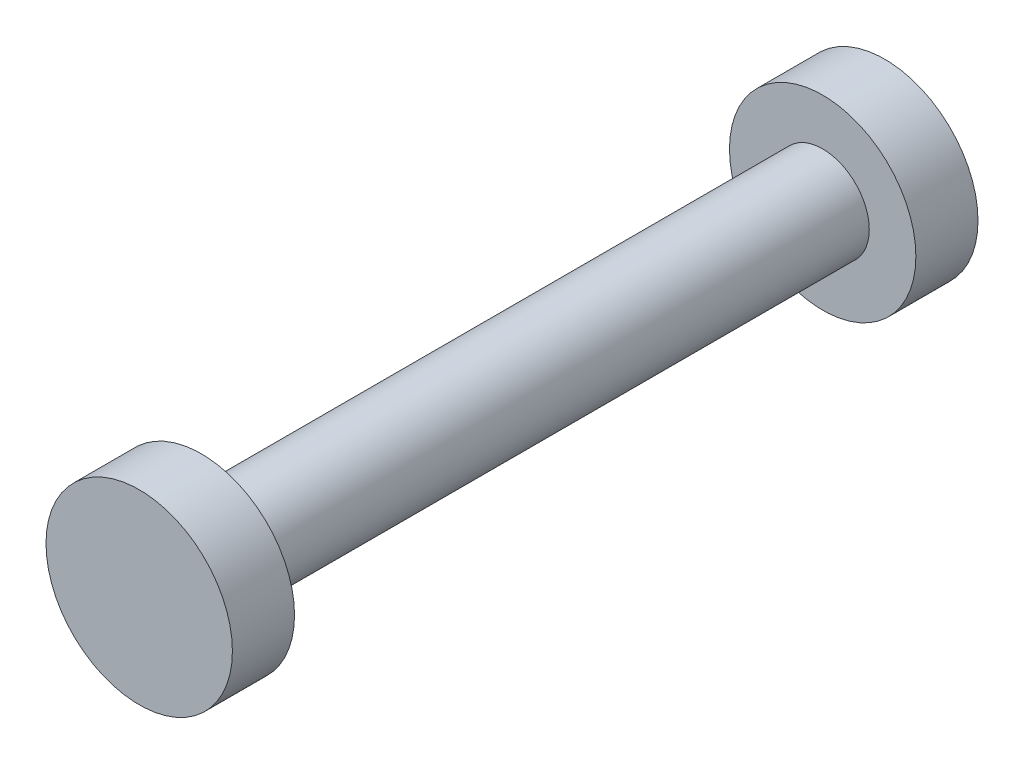
ISO-10303-21;
HEADER;
FILE_DESCRIPTION(('STEP AP214'),'2;1');
FILE_NAME('part.step','',(''),(''),'','','');
FILE_SCHEMA(('AUTOMOTIVE_DESIGN { 1 0 10303 214 1 1 1 1 }'));
ENDSEC;
DATA;
#1=APPLICATION_CONTEXT('core data for automotive mechanical design processes');
#2=APPLICATION_PROTOCOL_DEFINITION('international standard','automotive_design',2000,#1);
#3=PRODUCT_CONTEXT('',#1,'mechanical');
#4=PRODUCT('Part','Part','',(#3));
#5=PRODUCT_RELATED_PRODUCT_CATEGORY('part','',(#4));
#6=PRODUCT_DEFINITION_FORMATION('','',#4);
#7=PRODUCT_DEFINITION_CONTEXT('part definition',#1,'design');
#8=PRODUCT_DEFINITION('design','',#6,#7);
#9=PRODUCT_DEFINITION_SHAPE('','',#8);
#10=(LENGTH_UNIT() NAMED_UNIT(*) SI_UNIT(.MILLI.,.METRE.));
#11=(NAMED_UNIT(*) PLANE_ANGLE_UNIT() SI_UNIT($,.RADIAN.));
#12=(NAMED_UNIT(*) SI_UNIT($,.STERADIAN.) SOLID_ANGLE_UNIT());
#13=UNCERTAINTY_MEASURE_WITH_UNIT(LENGTH_MEASURE(1.E-05),#10,'distance_accuracy_value','');
#14=(GEOMETRIC_REPRESENTATION_CONTEXT(3) GLOBAL_UNCERTAINTY_ASSIGNED_CONTEXT((#13)) GLOBAL_UNIT_ASSIGNED_CONTEXT((#10,
#11,#12)) REPRESENTATION_CONTEXT('',''));
#15=CARTESIAN_POINT('',(0.,0.,0.));
#16=DIRECTION('',(0.,0.,1.));
#17=DIRECTION('',(1.,0.,0.));
#18=AXIS2_PLACEMENT_3D('',#15,#16,#17);
#19=CARTESIAN_POINT('',(0.,0.,5.));
#20=DIRECTION('',(0.,0.,-1.));
#21=DIRECTION('',(-1.,0.,0.));
#22=AXIS2_PLACEMENT_3D('',#19,#20,#21);
#23=CYLINDRICAL_SURFACE('',#22,0.75);
#24=CARTESIAN_POINT('',(0.,0.,5.));
#25=DIRECTION('',(0.,0.,1.));
#26=DIRECTION('',(1.,0.,0.));
#27=AXIS2_PLACEMENT_3D('',#24,#25,#26);
#28=CIRCLE('',#27,0.75);
#29=CARTESIAN_POINT('',(0.75,0.,5.));
#30=VERTEX_POINT('',#29);
#31=EDGE_CURVE('E10',#30,#30,#28,.T.);
#32=ORIENTED_EDGE('',*,*,#31,.F.);
#33=EDGE_LOOP('',(#32));
#34=FACE_BOUND('',#33,.T.);
#35=CARTESIAN_POINT('',(0.,0.,-5.));
#36=DIRECTION('',(0.,0.,1.));
#37=DIRECTION('',(1.,0.,0.));
#38=AXIS2_PLACEMENT_3D('',#35,#36,#37);
#39=CIRCLE('',#38,0.75);
#40=CARTESIAN_POINT('',(0.75,0.,-5.));
#41=VERTEX_POINT('',#40);
#42=EDGE_CURVE('E44',#41,#41,#39,.T.);
#43=ORIENTED_EDGE('',*,*,#42,.T.);
#44=EDGE_LOOP('',(#43));
#45=FACE_BOUND('',#44,.T.);
#46=ADVANCED_FACE('F41',(#34,#45),#23,.T.);
#47=CARTESIAN_POINT('',(0.,0.,6.));
#48=DIRECTION('',(0.,0.,-1.));
#49=DIRECTION('',(-1.,0.,0.));
#50=AXIS2_PLACEMENT_3D('',#47,#48,#49);
#51=CYLINDRICAL_SURFACE('',#50,1.5);
#52=CARTESIAN_POINT('',(0.,0.,6.));
#53=DIRECTION('',(0.,0.,1.));
#54=DIRECTION('',(1.,0.,0.));
#55=AXIS2_PLACEMENT_3D('',#52,#53,#54);
#56=CIRCLE('',#55,1.5);
#57=CARTESIAN_POINT('',(1.5,0.,6.));
#58=VERTEX_POINT('',#57);
#59=EDGE_CURVE('E49',#58,#58,#56,.T.);
#60=ORIENTED_EDGE('',*,*,#59,.F.);
#61=EDGE_LOOP('',(#60));
#62=FACE_BOUND('',#61,.T.);
#63=CARTESIAN_POINT('',(0.,0.,5.));
#64=DIRECTION('',(0.,0.,1.));
#65=DIRECTION('',(1.,0.,0.));
#66=AXIS2_PLACEMENT_3D('',#63,#64,#65);
#67=CIRCLE('',#66,1.5);
#68=CARTESIAN_POINT('',(1.5,0.,5.));
#69=VERTEX_POINT('',#68);
#70=EDGE_CURVE('E54',#69,#69,#67,.T.);
#71=ORIENTED_EDGE('',*,*,#70,.T.);
#72=EDGE_LOOP('',(#71));
#73=FACE_BOUND('',#72,.T.);
#74=ADVANCED_FACE('F95',(#62,#73),#51,.T.);
#75=CARTESIAN_POINT('',(0.,0.,6.));
#76=DIRECTION('',(0.,0.,1.));
#77=DIRECTION('',(1.,0.,0.));
#78=AXIS2_PLACEMENT_3D('',#75,#76,#77);
#79=PLANE('',#78);
#80=ORIENTED_EDGE('',*,*,#59,.T.);
#81=EDGE_LOOP('',(#80));
#82=FACE_BOUND('',#81,.T.);
#83=ADVANCED_FACE('F91',(#82),#79,.T.);
#84=CARTESIAN_POINT('',(0.,0.,5.));
#85=DIRECTION('',(0.,0.,1.));
#86=DIRECTION('',(1.,0.,0.));
#87=AXIS2_PLACEMENT_3D('',#84,#85,#86);
#88=PLANE('',#87);
#89=ORIENTED_EDGE('',*,*,#31,.T.);
#90=EDGE_LOOP('',(#89));
#91=FACE_BOUND('',#90,.T.);
#92=ORIENTED_EDGE('',*,*,#70,.F.);
#93=EDGE_LOOP('',(#92));
#94=FACE_BOUND('',#93,.T.);
#95=ADVANCED_FACE('F83',(#91,#94),#88,.F.);
#96=CARTESIAN_POINT('',(0.,0.,-6.));
#97=DIRECTION('',(0.,0.,1.));
#98=DIRECTION('',(1.,0.,0.));
#99=AXIS2_PLACEMENT_3D('',#96,#97,#98);
#100=CYLINDRICAL_SURFACE('',#99,1.5);
#101=CARTESIAN_POINT('',(0.,0.,-6.));
#102=DIRECTION('',(0.,0.,-1.));
#103=DIRECTION('',(-1.,0.,0.));
#104=AXIS2_PLACEMENT_3D('',#101,#102,#103);
#105=CIRCLE('',#104,1.5);
#106=CARTESIAN_POINT('',(-1.5,0.,-6.));
#107=VERTEX_POINT('',#106);
#108=EDGE_CURVE('E64',#107,#107,#105,.T.);
#109=ORIENTED_EDGE('',*,*,#108,.F.);
#110=EDGE_LOOP('',(#109));
#111=FACE_BOUND('',#110,.T.);
#112=CARTESIAN_POINT('',(0.,0.,-5.));
#113=DIRECTION('',(0.,0.,-1.));
#114=DIRECTION('',(-1.,0.,0.));
#115=AXIS2_PLACEMENT_3D('',#112,#113,#114);
#116=CIRCLE('',#115,1.5);
#117=CARTESIAN_POINT('',(-1.5,0.,-5.));
#118=VERTEX_POINT('',#117);
#119=EDGE_CURVE('E60',#118,#118,#116,.T.);
#120=ORIENTED_EDGE('',*,*,#119,.T.);
#121=EDGE_LOOP('',(#120));
#122=FACE_BOUND('',#121,.T.);
#123=ADVANCED_FACE('F81',(#111,#122),#100,.T.);
#124=CARTESIAN_POINT('',(0.,0.,-6.));
#125=DIRECTION('',(0.,0.,-1.));
#126=DIRECTION('',(-1.,0.,0.));
#127=AXIS2_PLACEMENT_3D('',#124,#125,#126);
#128=PLANE('',#127);
#129=ORIENTED_EDGE('',*,*,#108,.T.);
#130=EDGE_LOOP('',(#129));
#131=FACE_BOUND('',#130,.T.);
#132=ADVANCED_FACE('F77',(#131),#128,.T.);
#133=CARTESIAN_POINT('',(0.,0.,-5.));
#134=DIRECTION('',(0.,0.,-1.));
#135=DIRECTION('',(-1.,0.,0.));
#136=AXIS2_PLACEMENT_3D('',#133,#134,#135);
#137=PLANE('',#136);
#138=ORIENTED_EDGE('',*,*,#42,.F.);
#139=EDGE_LOOP('',(#138));
#140=FACE_BOUND('',#139,.T.);
#141=ORIENTED_EDGE('',*,*,#119,.F.);
#142=EDGE_LOOP('',(#141));
#143=FACE_BOUND('',#142,.T.);
#144=ADVANCED_FACE('F74',(#140,#143),#137,.F.);
#145=CLOSED_SHELL('',(#46,#74,#83,#95,#123,#132,#144));
#146=MANIFOLD_SOLID_BREP('B2',#145);
#147=ADVANCED_BREP_SHAPE_REPRESENTATION('',(#18,#146),#14);
#148=SHAPE_DEFINITION_REPRESENTATION(#9,#147);
ENDSEC;
END-ISO-10303-21;
